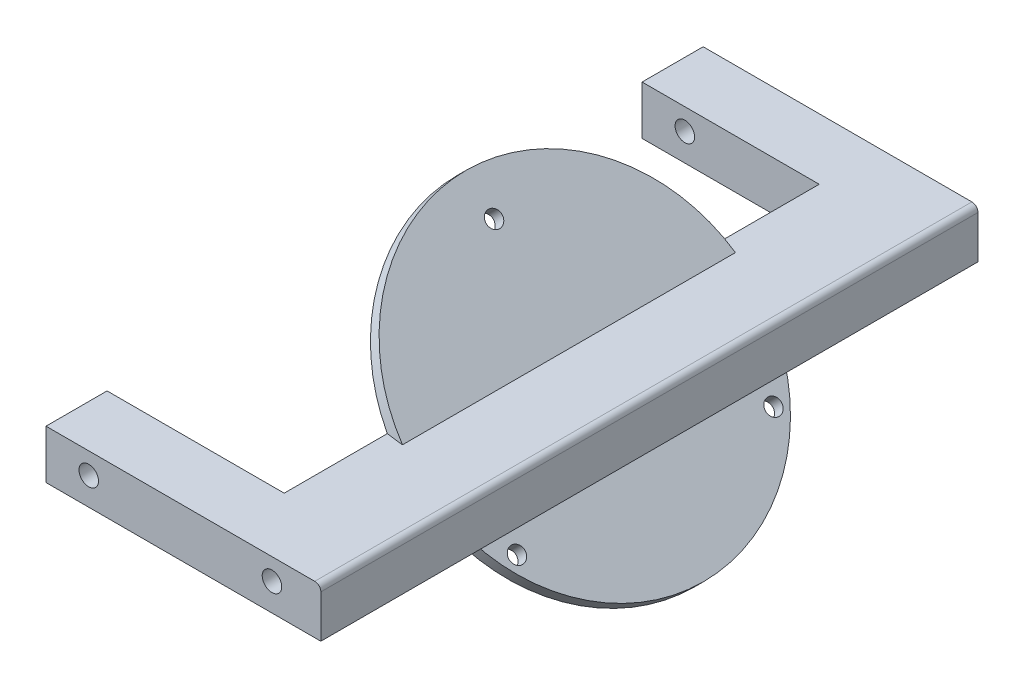
ISO-10303-21;
HEADER;
FILE_DESCRIPTION(('STEP AP214'),'2;1');
FILE_NAME('part.step','',(''),(''),'','','');
FILE_SCHEMA(('AUTOMOTIVE_DESIGN { 1 0 10303 214 1 1 1 1 }'));
ENDSEC;
DATA;
#1=APPLICATION_CONTEXT('core data for automotive mechanical design processes');
#2=APPLICATION_PROTOCOL_DEFINITION('international standard','automotive_design',2000,#1);
#3=PRODUCT_CONTEXT('',#1,'mechanical');
#4=PRODUCT('Part','Part','',(#3));
#5=PRODUCT_RELATED_PRODUCT_CATEGORY('part','',(#4));
#6=PRODUCT_DEFINITION_FORMATION('','',#4);
#7=PRODUCT_DEFINITION_CONTEXT('part definition',#1,'design');
#8=PRODUCT_DEFINITION('design','',#6,#7);
#9=PRODUCT_DEFINITION_SHAPE('','',#8);
#10=(LENGTH_UNIT() NAMED_UNIT(*) SI_UNIT(.MILLI.,.METRE.));
#11=(NAMED_UNIT(*) PLANE_ANGLE_UNIT() SI_UNIT($,.RADIAN.));
#12=(NAMED_UNIT(*) SI_UNIT($,.STERADIAN.) SOLID_ANGLE_UNIT());
#13=UNCERTAINTY_MEASURE_WITH_UNIT(LENGTH_MEASURE(1.E-05),#10,'distance_accuracy_value','');
#14=(GEOMETRIC_REPRESENTATION_CONTEXT(3) GLOBAL_UNCERTAINTY_ASSIGNED_CONTEXT((#13)) GLOBAL_UNIT_ASSIGNED_CONTEXT((#10,
#11,#12)) REPRESENTATION_CONTEXT('',''));
#15=CARTESIAN_POINT('',(0.,0.,0.));
#16=DIRECTION('',(0.,0.,1.));
#17=DIRECTION('',(1.,0.,0.));
#18=AXIS2_PLACEMENT_3D('',#15,#16,#17);
#19=CARTESIAN_POINT('',(0.,-4.,53.8));
#20=DIRECTION('',(0.707106781186551,0.707106781186544,0.));
#21=DIRECTION('',(-0.707106781186544,0.707106781186551,0.));
#22=AXIS2_PLACEMENT_3D('',#19,#20,#21);
#23=PLANE('',#22);
#24=CARTESIAN_POINT('',(-3.99999999999998,0.,0.));
#25=DIRECTION('',(0.707106781186551,0.707106781186544,0.));
#26=DIRECTION('',(-0.707106781186544,0.707106781186551,0.));
#27=AXIS2_PLACEMENT_3D('',#24,#25,#26);
#28=CIRCLE('',#27,12.);
#29=CARTESIAN_POINT('',(-12.4852813742385,8.48528137423861,0.));
#30=VERTEX_POINT('',#29);
#31=EDGE_CURVE('E213',#30,#30,#28,.T.);
#32=ORIENTED_EDGE('',*,*,#31,.T.);
#33=EDGE_LOOP('',(#32));
#34=FACE_BOUND('',#33,.T.);
#35=CARTESIAN_POINT('',(-18.8492424049174,14.8492424049176,0.));
#36=DIRECTION('',(0.707106781186551,0.707106781186544,0.));
#37=DIRECTION('',(-0.707106781186544,0.707106781186551,0.));
#38=AXIS2_PLACEMENT_3D('',#35,#36,#37);
#39=CIRCLE('',#38,1.29999999999999);
#40=CARTESIAN_POINT('',(-19.7684812204599,15.7684812204601,0.));
#41=VERTEX_POINT('',#40);
#42=EDGE_CURVE('E221',#41,#41,#39,.T.);
#43=ORIENTED_EDGE('',*,*,#42,.T.);
#44=EDGE_LOOP('',(#43));
#45=FACE_BOUND('',#44,.T.);
#46=CARTESIAN_POINT('',(5.89949493661166,-9.89949493661172,-21.));
#47=DIRECTION('',(0.707106781186551,0.707106781186544,0.));
#48=DIRECTION('',(-0.707106781186544,0.707106781186551,0.));
#49=AXIS2_PLACEMENT_3D('',#46,#47,#48);
#50=CIRCLE('',#49,1.29999999999999);
#51=CARTESIAN_POINT('',(4.98025612106916,-8.98025612106921,-21.));
#52=VERTEX_POINT('',#51);
#53=EDGE_CURVE('E229',#52,#52,#50,.T.);
#54=ORIENTED_EDGE('',*,*,#53,.T.);
#55=EDGE_LOOP('',(#54));
#56=FACE_BOUND('',#55,.T.);
#57=CARTESIAN_POINT('',(5.89949493661166,-9.89949493661172,21.));
#58=DIRECTION('',(0.707106781186551,0.707106781186544,0.));
#59=DIRECTION('',(-0.707106781186544,0.707106781186551,0.));
#60=AXIS2_PLACEMENT_3D('',#57,#58,#59);
#61=CIRCLE('',#60,1.29999999999999);
#62=CARTESIAN_POINT('',(4.98025612106916,-8.98025612106921,21.));
#63=VERTEX_POINT('',#62);
#64=EDGE_CURVE('E237',#63,#63,#61,.T.);
#65=ORIENTED_EDGE('',*,*,#64,.T.);
#66=EDGE_LOOP('',(#65));
#67=FACE_BOUND('',#66,.T.);
#68=DIRECTION('',(-0.707106781186546,0.707106781186548,0.));
#69=VECTOR('',#68,1.);
#70=CARTESIAN_POINT('',(-7.99999999999994,3.99999999999996,-43.8));
#71=LINE('',#70,#69);
#72=CARTESIAN_POINT('',(0.,-4.,-43.8));
#73=VERTEX_POINT('',#72);
#74=CARTESIAN_POINT('',(-7.99999999999991,4.,-43.8));
#75=VERTEX_POINT('',#74);
#76=EDGE_CURVE('E167',#73,#75,#71,.T.);
#77=ORIENTED_EDGE('',*,*,#76,.F.);
#78=DIRECTION('',(0.,0.,-1.));
#79=VECTOR('',#78,1.);
#80=CARTESIAN_POINT('',(0.,-4.,53.8));
#81=LINE('',#80,#79);
#82=CARTESIAN_POINT('',(0.,-4.,-26.9118932815958));
#83=VERTEX_POINT('',#82);
#84=EDGE_CURVE('E165',#83,#73,#81,.T.);
#85=ORIENTED_EDGE('',*,*,#84,.F.);
#86=CARTESIAN_POINT('',(-3.99999999999997,0.,0.));
#87=DIRECTION('',(-0.707106781186548,-0.707106781186548,0.));
#88=DIRECTION('',(0.707106781186548,-0.707106781186548,0.));
#89=AXIS2_PLACEMENT_3D('',#86,#87,#88);
#90=CIRCLE('',#89,27.5);
#91=CARTESIAN_POINT('',(0.,-4.,26.9118932815958));
#92=VERTEX_POINT('',#91);
#93=EDGE_CURVE('E241',#83,#92,#90,.T.);
#94=ORIENTED_EDGE('',*,*,#93,.T.);
#95=CARTESIAN_POINT('',(0.,-4.,43.8));
#96=VERTEX_POINT('',#95);
#97=EDGE_CURVE('E281',#96,#92,#81,.T.);
#98=ORIENTED_EDGE('',*,*,#97,.F.);
#99=DIRECTION('',(-0.707106781186546,0.707106781186548,0.));
#100=VECTOR('',#99,1.);
#101=CARTESIAN_POINT('',(-7.99999999999994,3.99999999999996,43.8));
#102=LINE('',#101,#100);
#103=CARTESIAN_POINT('',(-7.99999999999994,3.99999999999996,43.8));
#104=VERTEX_POINT('',#103);
#105=EDGE_CURVE('E190',#96,#104,#102,.T.);
#106=ORIENTED_EDGE('',*,*,#105,.T.);
#107=DIRECTION('',(0.,0.,-1.));
#108=VECTOR('',#107,1.);
#109=CARTESIAN_POINT('',(-7.99999999999991,4.,53.8));
#110=LINE('',#109,#108);
#111=CARTESIAN_POINT('',(-7.99999999999994,3.99999999999996,26.9118932815958));
#112=VERTEX_POINT('',#111);
#113=EDGE_CURVE('E285',#104,#112,#110,.T.);
#114=ORIENTED_EDGE('',*,*,#113,.T.);
#115=CARTESIAN_POINT('',(-7.99999999999991,4.,-26.9118932815958));
#116=VERTEX_POINT('',#115);
#117=EDGE_CURVE('E247',#112,#116,#90,.T.);
#118=ORIENTED_EDGE('',*,*,#117,.T.);
#119=EDGE_CURVE('E284',#116,#75,#110,.T.);
#120=ORIENTED_EDGE('',*,*,#119,.T.);
#121=EDGE_LOOP('',(#77,#85,#94,#98,#106,#114,#118,#120));
#122=FACE_BOUND('',#121,.T.);
#123=ADVANCED_FACE('F43',(#34,#45,#56,#67,#122),#23,.F.);
#124=CARTESIAN_POINT('',(7.99999999999991,4.,53.8));
#125=DIRECTION('',(-1.,0.,0.));
#126=DIRECTION('',(0.,0.,1.));
#127=AXIS2_PLACEMENT_3D('',#124,#125,#126);
#128=PLANE('',#127);
#129=DIRECTION('',(0.,1.,0.));
#130=VECTOR('',#129,1.);
#131=CARTESIAN_POINT('',(7.99999999999991,4.,-53.8));
#132=LINE('',#131,#130);
#133=CARTESIAN_POINT('',(7.99999999999991,-4.,-53.8));
#134=VERTEX_POINT('',#133);
#135=CARTESIAN_POINT('',(7.99999999999991,3.,-53.8));
#136=VERTEX_POINT('',#135);
#137=EDGE_CURVE('E270',#134,#136,#132,.T.);
#138=ORIENTED_EDGE('',*,*,#137,.T.);
#139=DIRECTION('',(0.,0.,-1.));
#140=VECTOR('',#139,1.);
#141=CARTESIAN_POINT('',(7.99999999999991,3.,53.8));
#142=LINE('',#141,#140);
#143=CARTESIAN_POINT('',(7.99999999999991,3.,53.8));
#144=VERTEX_POINT('',#143);
#145=EDGE_CURVE('E52',#136,#144,#142,.F.);
#146=ORIENTED_EDGE('',*,*,#145,.T.);
#147=DIRECTION('',(0.,1.,0.));
#148=VECTOR('',#147,1.);
#149=CARTESIAN_POINT('',(7.99999999999991,4.,53.8));
#150=LINE('',#149,#148);
#151=CARTESIAN_POINT('',(7.99999999999991,-4.,53.8));
#152=VERTEX_POINT('',#151);
#153=EDGE_CURVE('E259',#152,#144,#150,.T.);
#154=ORIENTED_EDGE('',*,*,#153,.F.);
#155=DIRECTION('',(0.,0.,-1.));
#156=VECTOR('',#155,1.);
#157=CARTESIAN_POINT('',(7.99999999999991,-4.,53.8));
#158=LINE('',#157,#156);
#159=EDGE_CURVE('E269',#152,#134,#158,.T.);
#160=ORIENTED_EDGE('',*,*,#159,.T.);
#161=EDGE_LOOP('',(#138,#146,#154,#160));
#162=FACE_BOUND('',#161,.T.);
#163=ADVANCED_FACE('F362',(#162),#128,.F.);
#164=CARTESIAN_POINT('',(7.99999999999991,4.,53.8));
#165=DIRECTION('',(0.,-1.,0.));
#166=DIRECTION('',(1.,0.,0.));
#167=AXIS2_PLACEMENT_3D('',#164,#165,#166);
#168=PLANE('',#167);
#169=DIRECTION('',(-1.,0.,0.));
#170=VECTOR('',#169,1.);
#171=CARTESIAN_POINT('',(7.99999999999991,4.,53.8));
#172=LINE('',#171,#170);
#173=CARTESIAN_POINT('',(6.99999999999991,4.,53.8));
#174=VERTEX_POINT('',#173);
#175=CARTESIAN_POINT('',(-37.0000000000001,3.99999999999996,53.8));
#176=VERTEX_POINT('',#175);
#177=EDGE_CURVE('E262',#174,#176,#172,.T.);
#178=ORIENTED_EDGE('',*,*,#177,.F.);
#179=DIRECTION('',(0.,0.,-1.));
#180=VECTOR('',#179,1.);
#181=CARTESIAN_POINT('',(6.99999999999991,4.,53.8));
#182=LINE('',#181,#180);
#183=CARTESIAN_POINT('',(6.99999999999991,4.,-53.8));
#184=VERTEX_POINT('',#183);
#185=EDGE_CURVE('E304',#174,#184,#182,.T.);
#186=ORIENTED_EDGE('',*,*,#185,.T.);
#187=DIRECTION('',(-1.,0.,0.));
#188=VECTOR('',#187,1.);
#189=CARTESIAN_POINT('',(7.99999999999991,4.,-53.8));
#190=LINE('',#189,#188);
#191=CARTESIAN_POINT('',(-37.0000000000001,3.99999999999996,-53.8));
#192=VERTEX_POINT('',#191);
#193=EDGE_CURVE('E273',#184,#192,#190,.T.);
#194=ORIENTED_EDGE('',*,*,#193,.T.);
#195=DIRECTION('',(0.,0.,-1.));
#196=VECTOR('',#195,1.);
#197=CARTESIAN_POINT('',(-37.0000000000001,3.99999999999996,-43.8));
#198=LINE('',#197,#196);
#199=CARTESIAN_POINT('',(-37.0000000000001,3.99999999999996,-43.8));
#200=VERTEX_POINT('',#199);
#201=EDGE_CURVE('E160',#200,#192,#198,.T.);
#202=ORIENTED_EDGE('',*,*,#201,.F.);
#203=DIRECTION('',(-1.,0.,0.));
#204=VECTOR('',#203,1.);
#205=CARTESIAN_POINT('',(-37.0000000000001,3.99999999999996,-43.8));
#206=LINE('',#205,#204);
#207=EDGE_CURVE('E146',#75,#200,#206,.T.);
#208=ORIENTED_EDGE('',*,*,#207,.F.);
#209=ORIENTED_EDGE('',*,*,#119,.F.);
#210=CARTESIAN_POINT('',(0.,4.,0.));
#211=DIRECTION('',(0.,-1.,0.));
#212=DIRECTION('',(-1.,0.,0.));
#213=AXIS2_PLACEMENT_3D('',#210,#211,#212);
#214=ELLIPSE('',#213,38.8908729652601,27.5);
#215=CARTESIAN_POINT('',(-5.17157287525379,4.,-27.2557776810343));
#216=VERTEX_POINT('',#215);
#217=EDGE_CURVE('E258',#116,#216,#214,.T.);
#218=ORIENTED_EDGE('',*,*,#217,.T.);
#219=DIRECTION('',(0.,0.,-1.));
#220=VECTOR('',#219,1.);
#221=CARTESIAN_POINT('',(-5.1715728752538,4.,53.8));
#222=LINE('',#221,#220);
#223=CARTESIAN_POINT('',(-5.17157287525379,4.,27.2557776810343));
#224=VERTEX_POINT('',#223);
#225=EDGE_CURVE('E251',#224,#216,#222,.T.);
#226=ORIENTED_EDGE('',*,*,#225,.F.);
#227=EDGE_CURVE('E254',#224,#112,#214,.T.);
#228=ORIENTED_EDGE('',*,*,#227,.T.);
#229=ORIENTED_EDGE('',*,*,#113,.F.);
#230=DIRECTION('',(-1.,0.,0.));
#231=VECTOR('',#230,1.);
#232=CARTESIAN_POINT('',(-37.0000000000001,3.99999999999996,43.8));
#233=LINE('',#232,#231);
#234=CARTESIAN_POINT('',(-37.0000000000001,3.99999999999996,43.8));
#235=VERTEX_POINT('',#234);
#236=EDGE_CURVE('E179',#104,#235,#233,.T.);
#237=ORIENTED_EDGE('',*,*,#236,.T.);
#238=DIRECTION('',(0.,0.,1.));
#239=VECTOR('',#238,1.);
#240=CARTESIAN_POINT('',(-37.0000000000001,3.99999999999996,43.8));
#241=LINE('',#240,#239);
#242=EDGE_CURVE('E194',#235,#176,#241,.T.);
#243=ORIENTED_EDGE('',*,*,#242,.T.);
#244=EDGE_LOOP('',(#178,#186,#194,#202,#208,#209,#218,#226,#228,#229,#237,#243));
#245=FACE_BOUND('',#244,.T.);
#246=ADVANCED_FACE('F334',(#245),#168,.F.);
#247=CARTESIAN_POINT('',(7.99999999999991,-4.,53.8));
#248=DIRECTION('',(0.,1.,0.));
#249=DIRECTION('',(0.,0.,1.));
#250=AXIS2_PLACEMENT_3D('',#247,#248,#249);
#251=PLANE('',#250);
#252=DIRECTION('',(1.,0.,0.));
#253=VECTOR('',#252,1.);
#254=CARTESIAN_POINT('',(7.99999999999991,-4.,53.8));
#255=LINE('',#254,#253);
#256=CARTESIAN_POINT('',(-37.0000000000001,-4.,53.8));
#257=VERTEX_POINT('',#256);
#258=EDGE_CURVE('E266',#257,#152,#255,.T.);
#259=ORIENTED_EDGE('',*,*,#258,.F.);
#260=DIRECTION('',(0.,0.,1.));
#261=VECTOR('',#260,1.);
#262=CARTESIAN_POINT('',(-37.0000000000001,-4.,43.8));
#263=LINE('',#262,#261);
#264=CARTESIAN_POINT('',(-37.0000000000001,-4.,43.8));
#265=VERTEX_POINT('',#264);
#266=EDGE_CURVE('E198',#265,#257,#263,.T.);
#267=ORIENTED_EDGE('',*,*,#266,.F.);
#268=DIRECTION('',(1.,0.,0.));
#269=VECTOR('',#268,1.);
#270=CARTESIAN_POINT('',(0.,-4.,43.8));
#271=LINE('',#270,#269);
#272=EDGE_CURVE('E187',#265,#96,#271,.T.);
#273=ORIENTED_EDGE('',*,*,#272,.T.);
#274=ORIENTED_EDGE('',*,*,#97,.T.);
#275=CARTESIAN_POINT('',(-7.99999999999996,-4.,0.));
#276=DIRECTION('',(0.,1.,0.));
#277=DIRECTION('',(-1.,0.,0.));
#278=AXIS2_PLACEMENT_3D('',#275,#276,#277);
#279=ELLIPSE('',#278,38.8908729652601,27.5);
#280=CARTESIAN_POINT('',(2.82842712474621,-4.,26.4125459394211));
#281=VERTEX_POINT('',#280);
#282=EDGE_CURVE('E295',#92,#281,#279,.T.);
#283=ORIENTED_EDGE('',*,*,#282,.T.);
#284=DIRECTION('',(0.,0.,1.));
#285=VECTOR('',#284,1.);
#286=CARTESIAN_POINT('',(2.8284271247462,-4.,53.8));
#287=LINE('',#286,#285);
#288=CARTESIAN_POINT('',(2.82842712474621,-4.,-26.4125459394211));
#289=VERTEX_POINT('',#288);
#290=EDGE_CURVE('E288',#289,#281,#287,.T.);
#291=ORIENTED_EDGE('',*,*,#290,.F.);
#292=EDGE_CURVE('E292',#289,#83,#279,.T.);
#293=ORIENTED_EDGE('',*,*,#292,.T.);
#294=ORIENTED_EDGE('',*,*,#84,.T.);
#295=DIRECTION('',(1.,0.,0.));
#296=VECTOR('',#295,1.);
#297=CARTESIAN_POINT('',(0.,-4.,-43.8));
#298=LINE('',#297,#296);
#299=CARTESIAN_POINT('',(-37.0000000000001,-4.,-43.8));
#300=VERTEX_POINT('',#299);
#301=EDGE_CURVE('E144',#300,#73,#298,.T.);
#302=ORIENTED_EDGE('',*,*,#301,.F.);
#303=DIRECTION('',(0.,0.,-1.));
#304=VECTOR('',#303,1.);
#305=CARTESIAN_POINT('',(-37.0000000000001,-4.,-43.8));
#306=LINE('',#305,#304);
#307=CARTESIAN_POINT('',(-37.0000000000001,-4.,-53.8));
#308=VERTEX_POINT('',#307);
#309=EDGE_CURVE('E151',#300,#308,#306,.T.);
#310=ORIENTED_EDGE('',*,*,#309,.T.);
#311=DIRECTION('',(1.,0.,0.));
#312=VECTOR('',#311,1.);
#313=CARTESIAN_POINT('',(7.99999999999991,-4.,-53.8));
#314=LINE('',#313,#312);
#315=EDGE_CURVE('E263',#308,#134,#314,.T.);
#316=ORIENTED_EDGE('',*,*,#315,.T.);
#317=ORIENTED_EDGE('',*,*,#159,.F.);
#318=EDGE_LOOP('',(#259,#267,#273,#274,#283,#291,#293,#294,#302,#310,#316,#317));
#319=FACE_BOUND('',#318,.T.);
#320=ADVANCED_FACE('F163',(#319),#251,.F.);
#321=CARTESIAN_POINT('',(0.,0.,53.8));
#322=DIRECTION('',(0.,0.,-1.));
#323=DIRECTION('',(-1.,0.,0.));
#324=AXIS2_PLACEMENT_3D('',#321,#322,#323);
#325=PLANE('',#324);
#326=CARTESIAN_POINT('',(-30.0000000000001,0.499999999999999,53.8));
#327=DIRECTION('',(0.,0.,1.));
#328=DIRECTION('',(1.,0.,0.));
#329=AXIS2_PLACEMENT_3D('',#326,#327,#328);
#330=CIRCLE('',#329,1.59999999999999);
#331=CARTESIAN_POINT('',(-28.4000000000001,0.499999999999999,53.8));
#332=VERTEX_POINT('',#331);
#333=EDGE_CURVE('E343',#332,#332,#330,.T.);
#334=ORIENTED_EDGE('',*,*,#333,.F.);
#335=EDGE_LOOP('',(#334));
#336=FACE_BOUND('',#335,.T.);
#337=CARTESIAN_POINT('',(0.,0.499999999999999,53.8));
#338=DIRECTION('',(0.,0.,1.));
#339=DIRECTION('',(1.,0.,0.));
#340=AXIS2_PLACEMENT_3D('',#337,#338,#339);
#341=CIRCLE('',#340,1.59999999999999);
#342=CARTESIAN_POINT('',(1.59999999999999,0.499999999999999,53.8));
#343=VERTEX_POINT('',#342);
#344=EDGE_CURVE('E202',#343,#343,#341,.T.);
#345=ORIENTED_EDGE('',*,*,#344,.F.);
#346=EDGE_LOOP('',(#345));
#347=FACE_BOUND('',#346,.T.);
#348=ORIENTED_EDGE('',*,*,#153,.T.);
#349=CARTESIAN_POINT('',(6.99999999999991,3.,53.8));
#350=DIRECTION('',(0.,0.,-1.));
#351=DIRECTION('',(-1.,0.,0.));
#352=AXIS2_PLACEMENT_3D('',#349,#350,#351);
#353=CIRCLE('',#352,1.);
#354=EDGE_CURVE('E11',#144,#174,#353,.F.);
#355=ORIENTED_EDGE('',*,*,#354,.T.);
#356=ORIENTED_EDGE('',*,*,#177,.T.);
#357=DIRECTION('',(0.,-1.,0.));
#358=VECTOR('',#357,1.);
#359=CARTESIAN_POINT('',(-37.0000000000001,-4.,53.8));
#360=LINE('',#359,#358);
#361=EDGE_CURVE('E177',#176,#257,#360,.T.);
#362=ORIENTED_EDGE('',*,*,#361,.T.);
#363=ORIENTED_EDGE('',*,*,#258,.T.);
#364=EDGE_LOOP('',(#348,#355,#356,#362,#363));
#365=FACE_BOUND('',#364,.T.);
#366=ADVANCED_FACE('F351',(#336,#347,#365),#325,.F.);
#367=CARTESIAN_POINT('',(0.,0.,-53.8));
#368=DIRECTION('',(0.,0.,-1.));
#369=DIRECTION('',(-1.,0.,0.));
#370=AXIS2_PLACEMENT_3D('',#367,#368,#369);
#371=PLANE('',#370);
#372=CARTESIAN_POINT('',(-30.0000000000001,0.499999999999999,-53.8));
#373=DIRECTION('',(0.,0.,1.));
#374=DIRECTION('',(1.,0.,0.));
#375=AXIS2_PLACEMENT_3D('',#372,#373,#374);
#376=CIRCLE('',#375,1.59999999999997);
#377=CARTESIAN_POINT('',(-28.4000000000001,0.499999999999999,-53.8));
#378=VERTEX_POINT('',#377);
#379=EDGE_CURVE('E309',#378,#378,#376,.T.);
#380=ORIENTED_EDGE('',*,*,#379,.T.);
#381=EDGE_LOOP('',(#380));
#382=FACE_BOUND('',#381,.T.);
#383=CARTESIAN_POINT('',(0.,0.499999999999999,-53.8));
#384=DIRECTION('',(0.,0.,1.));
#385=DIRECTION('',(1.,0.,0.));
#386=AXIS2_PLACEMENT_3D('',#383,#384,#385);
#387=CIRCLE('',#386,1.59999999999997);
#388=CARTESIAN_POINT('',(1.59999999999997,0.499999999999999,-53.8));
#389=VERTEX_POINT('',#388);
#390=EDGE_CURVE('E209',#389,#389,#387,.T.);
#391=ORIENTED_EDGE('',*,*,#390,.T.);
#392=EDGE_LOOP('',(#391));
#393=FACE_BOUND('',#392,.T.);
#394=ORIENTED_EDGE('',*,*,#193,.F.);
#395=CARTESIAN_POINT('',(6.99999999999991,3.,-53.8));
#396=DIRECTION('',(0.,0.,-1.));
#397=DIRECTION('',(-1.,0.,0.));
#398=AXIS2_PLACEMENT_3D('',#395,#396,#397);
#399=CIRCLE('',#398,1.);
#400=EDGE_CURVE('E66',#184,#136,#399,.T.);
#401=ORIENTED_EDGE('',*,*,#400,.T.);
#402=ORIENTED_EDGE('',*,*,#137,.F.);
#403=ORIENTED_EDGE('',*,*,#315,.F.);
#404=DIRECTION('',(0.,-1.,0.));
#405=VECTOR('',#404,1.);
#406=CARTESIAN_POINT('',(-37.0000000000001,-4.,-53.8));
#407=LINE('',#406,#405);
#408=EDGE_CURVE('E157',#192,#308,#407,.T.);
#409=ORIENTED_EDGE('',*,*,#408,.F.);
#410=EDGE_LOOP('',(#394,#401,#402,#403,#409));
#411=FACE_BOUND('',#410,.T.);
#412=ADVANCED_FACE('F354',(#382,#393,#411),#371,.T.);
#413=CARTESIAN_POINT('',(-0.585786437626897,-0.585786437626897,0.));
#414=DIRECTION('',(-0.707106781186548,-0.707106781186548,0.));
#415=DIRECTION('',(0.707106781186548,-0.707106781186548,0.));
#416=AXIS2_PLACEMENT_3D('',#413,#414,#415);
#417=PLANE('',#416);
#418=CARTESIAN_POINT('',(7.31370849898479,-8.48528137423859,-21.));
#419=DIRECTION('',(0.707106781186548,0.707106781186547,0.));
#420=DIRECTION('',(-0.707106781186547,0.707106781186548,0.));
#421=AXIS2_PLACEMENT_3D('',#418,#419,#420);
#422=CIRCLE('',#421,1.3);
#423=CARTESIAN_POINT('',(6.39446968344228,-7.56604255869608,-21.));
#424=VERTEX_POINT('',#423);
#425=EDGE_CURVE('E225',#424,#424,#422,.T.);
#426=ORIENTED_EDGE('',*,*,#425,.F.);
#427=EDGE_LOOP('',(#426));
#428=FACE_BOUND('',#427,.T.);
#429=CARTESIAN_POINT('',(7.31370849898479,-8.48528137423859,21.));
#430=DIRECTION('',(0.707106781186548,0.707106781186547,0.));
#431=DIRECTION('',(-0.707106781186547,0.707106781186548,0.));
#432=AXIS2_PLACEMENT_3D('',#429,#430,#431);
#433=CIRCLE('',#432,1.3);
#434=CARTESIAN_POINT('',(6.39446968344228,-7.56604255869608,21.));
#435=VERTEX_POINT('',#434);
#436=EDGE_CURVE('E233',#435,#435,#433,.T.);
#437=ORIENTED_EDGE('',*,*,#436,.F.);
#438=EDGE_LOOP('',(#437));
#439=FACE_BOUND('',#438,.T.);
#440=CARTESIAN_POINT('',(-2.58578643762687,1.41421356237309,0.));
#441=DIRECTION('',(-0.707106781186548,-0.707106781186548,0.));
#442=DIRECTION('',(0.707106781186548,-0.707106781186548,0.));
#443=AXIS2_PLACEMENT_3D('',#440,#441,#442);
#444=CIRCLE('',#443,27.5);
#445=EDGE_CURVE('E242',#289,#281,#444,.T.);
#446=ORIENTED_EDGE('',*,*,#445,.F.);
#447=ORIENTED_EDGE('',*,*,#290,.T.);
#448=EDGE_LOOP('',(#446,#447));
#449=FACE_BOUND('',#448,.T.);
#450=ADVANCED_FACE('F414',(#428,#439,#449),#417,.F.);
#451=CARTESIAN_POINT('',(-2.58578643762687,1.41421356237309,0.));
#452=DIRECTION('',(-0.707106781186547,-0.707106781186548,0.));
#453=DIRECTION('',(0.707106781186548,-0.707106781186547,0.));
#454=AXIS2_PLACEMENT_3D('',#451,#452,#453);
#455=CYLINDRICAL_SURFACE('',#454,27.5);
#456=ORIENTED_EDGE('',*,*,#282,.F.);
#457=ORIENTED_EDGE('',*,*,#93,.F.);
#458=ORIENTED_EDGE('',*,*,#292,.F.);
#459=ORIENTED_EDGE('',*,*,#445,.T.);
#460=EDGE_LOOP('',(#456,#457,#458,#459));
#461=FACE_BOUND('',#460,.T.);
#462=ADVANCED_FACE('F418',(#461),#455,.T.);
#463=ORIENTED_EDGE('',*,*,#217,.F.);
#464=ORIENTED_EDGE('',*,*,#117,.F.);
#465=ORIENTED_EDGE('',*,*,#227,.F.);
#466=EDGE_CURVE('E246',#224,#216,#444,.T.);
#467=ORIENTED_EDGE('',*,*,#466,.T.);
#468=EDGE_LOOP('',(#463,#464,#465,#467));
#469=FACE_BOUND('',#468,.T.);
#470=ADVANCED_FACE('F329',(#469),#455,.T.);
#471=CARTESIAN_POINT('',(-17.4350288425444,16.2634559672906,0.));
#472=DIRECTION('',(0.707106781186548,0.707106781186547,0.));
#473=DIRECTION('',(-0.707106781186547,0.707106781186548,0.));
#474=AXIS2_PLACEMENT_3D('',#471,#472,#473);
#475=CIRCLE('',#474,1.3);
#476=CARTESIAN_POINT('',(-18.3542676580869,17.1826947828331,0.));
#477=VERTEX_POINT('',#476);
#478=EDGE_CURVE('E217',#477,#477,#475,.T.);
#479=ORIENTED_EDGE('',*,*,#478,.F.);
#480=EDGE_LOOP('',(#479));
#481=FACE_BOUND('',#480,.T.);
#482=ORIENTED_EDGE('',*,*,#466,.F.);
#483=ORIENTED_EDGE('',*,*,#225,.T.);
#484=EDGE_LOOP('',(#482,#483));
#485=FACE_BOUND('',#484,.T.);
#486=ADVANCED_FACE('F402',(#481,#485),#417,.F.);
#487=CARTESIAN_POINT('',(7.31370849898479,-8.48528137423859,21.));
#488=DIRECTION('',(0.707106781186548,0.707106781186547,0.));
#489=DIRECTION('',(-0.707106781186547,0.707106781186548,0.));
#490=AXIS2_PLACEMENT_3D('',#487,#488,#489);
#491=CYLINDRICAL_SURFACE('',#490,1.29999999999999);
#492=ORIENTED_EDGE('',*,*,#436,.T.);
#493=EDGE_LOOP('',(#492));
#494=FACE_BOUND('',#493,.T.);
#495=ORIENTED_EDGE('',*,*,#64,.F.);
#496=EDGE_LOOP('',(#495));
#497=FACE_BOUND('',#496,.T.);
#498=ADVANCED_FACE('F399',(#494,#497),#491,.F.);
#499=CARTESIAN_POINT('',(7.31370849898479,-8.48528137423859,-21.));
#500=DIRECTION('',(0.707106781186548,0.707106781186547,0.));
#501=DIRECTION('',(-0.707106781186547,0.707106781186548,0.));
#502=AXIS2_PLACEMENT_3D('',#499,#500,#501);
#503=CYLINDRICAL_SURFACE('',#502,1.29999999999999);
#504=ORIENTED_EDGE('',*,*,#425,.T.);
#505=EDGE_LOOP('',(#504));
#506=FACE_BOUND('',#505,.T.);
#507=ORIENTED_EDGE('',*,*,#53,.F.);
#508=EDGE_LOOP('',(#507));
#509=FACE_BOUND('',#508,.T.);
#510=ADVANCED_FACE('F401',(#506,#509),#503,.F.);
#511=CARTESIAN_POINT('',(-17.4350288425444,16.2634559672906,0.));
#512=DIRECTION('',(0.707106781186548,0.707106781186547,0.));
#513=DIRECTION('',(-0.707106781186547,0.707106781186548,0.));
#514=AXIS2_PLACEMENT_3D('',#511,#512,#513);
#515=CYLINDRICAL_SURFACE('',#514,1.29999999999999);
#516=ORIENTED_EDGE('',*,*,#478,.T.);
#517=EDGE_LOOP('',(#516));
#518=FACE_BOUND('',#517,.T.);
#519=ORIENTED_EDGE('',*,*,#42,.F.);
#520=EDGE_LOOP('',(#519));
#521=FACE_BOUND('',#520,.T.);
#522=ADVANCED_FACE('F409',(#518,#521),#515,.F.);
#523=CARTESIAN_POINT('',(-9.30330085889911,-5.30330085889909,0.));
#524=DIRECTION('',(0.707106781186551,0.707106781186544,0.));
#525=DIRECTION('',(0.,0.,-1.));
#526=AXIS2_PLACEMENT_3D('',#523,#524,#525);
#527=SPHERICAL_SURFACE('',#526,6.5);
#528=CARTESIAN_POINT('',(-8.41786389677114,-4.41786389677112,0.));
#529=DIRECTION('',(-0.707106781186551,-0.707106781186544,0.));
#530=DIRECTION('',(0.707106781186544,-0.707106781186551,0.));
#531=AXIS2_PLACEMENT_3D('',#528,#529,#530);
#532=CIRCLE('',#531,6.37824448984163);
#533=CARTESIAN_POINT('',(-3.90776396593841,-8.9279638276039,0.));
#534=VERTEX_POINT('',#533);
#535=EDGE_CURVE('E300',#534,#534,#532,.T.);
#536=ORIENTED_EDGE('',*,*,#535,.T.);
#537=EDGE_LOOP('',(#536));
#538=FACE_BOUND('',#537,.T.);
#539=ADVANCED_FACE('F384',(#538),#527,.F.);
#540=CARTESIAN_POINT('',(-9.30330085889911,-5.30330085889909,0.));
#541=DIRECTION('',(0.707106781186551,0.707106781186544,0.));
#542=DIRECTION('',(-0.707106781186544,0.707106781186551,0.));
#543=AXIS2_PLACEMENT_3D('',#540,#541,#542);
#544=CONICAL_SURFACE('',#543,6.5,0.632748835002183);
#545=CARTESIAN_POINT('',(-8.558831989572,-4.55883198957198,0.));
#546=DIRECTION('',(-0.707106781186551,-0.707106781186544,0.));
#547=DIRECTION('',(0.707106781186544,-0.707106781186551,0.));
#548=AXIS2_PLACEMENT_3D('',#545,#546,#547);
#549=CIRCLE('',#548,7.27208117929577);
#550=CARTESIAN_POINT('',(-3.41669407435292,-9.70096990479112,0.));
#551=VERTEX_POINT('',#550);
#552=EDGE_CURVE('E296',#551,#551,#549,.F.);
#553=ORIENTED_EDGE('',*,*,#552,.T.);
#554=EDGE_LOOP('',(#553));
#555=FACE_BOUND('',#554,.T.);
#556=ORIENTED_EDGE('',*,*,#31,.F.);
#557=EDGE_LOOP('',(#556));
#558=FACE_BOUND('',#557,.T.);
#559=ADVANCED_FACE('F375',(#555,#558),#544,.T.);
#560=CARTESIAN_POINT('',(-8.34975336122283,-4.34975336122282,0.));
#561=DIRECTION('',(-0.707106781186551,-0.707106781186544,0.));
#562=DIRECTION('',(0.707106781186544,-0.707106781186551,0.));
#563=AXIS2_PLACEMENT_3D('',#560,#561,#562);
#564=TOROIDAL_SURFACE('',#563,6.86887868136791,0.5);
#565=ORIENTED_EDGE('',*,*,#535,.F.);
#566=EDGE_LOOP('',(#565));
#567=FACE_BOUND('',#566,.T.);
#568=ORIENTED_EDGE('',*,*,#552,.F.);
#569=EDGE_LOOP('',(#568));
#570=FACE_BOUND('',#569,.T.);
#571=ADVANCED_FACE('F372',(#567,#570),#564,.T.);
#572=CARTESIAN_POINT('',(0.,0.499999999999999,53.8));
#573=DIRECTION('',(0.,0.,1.));
#574=DIRECTION('',(1.,0.,0.));
#575=AXIS2_PLACEMENT_3D('',#572,#573,#574);
#576=CYLINDRICAL_SURFACE('',#575,1.59999999999998);
#577=ORIENTED_EDGE('',*,*,#390,.F.);
#578=EDGE_LOOP('',(#577));
#579=FACE_BOUND('',#578,.T.);
#580=ORIENTED_EDGE('',*,*,#344,.T.);
#581=EDGE_LOOP('',(#580));
#582=FACE_BOUND('',#581,.T.);
#583=ADVANCED_FACE('F374',(#579,#582),#576,.F.);
#584=CARTESIAN_POINT('',(-37.0000000000001,-4.,43.8));
#585=DIRECTION('',(-1.,0.,0.));
#586=DIRECTION('',(0.,0.,1.));
#587=AXIS2_PLACEMENT_3D('',#584,#585,#586);
#588=PLANE('',#587);
#589=ORIENTED_EDGE('',*,*,#361,.F.);
#590=ORIENTED_EDGE('',*,*,#242,.F.);
#591=DIRECTION('',(0.,-1.,0.));
#592=VECTOR('',#591,1.);
#593=CARTESIAN_POINT('',(-37.0000000000001,-4.,43.8));
#594=LINE('',#593,#592);
#595=EDGE_CURVE('E183',#235,#265,#594,.T.);
#596=ORIENTED_EDGE('',*,*,#595,.T.);
#597=ORIENTED_EDGE('',*,*,#266,.T.);
#598=EDGE_LOOP('',(#589,#590,#596,#597));
#599=FACE_BOUND('',#598,.T.);
#600=ADVANCED_FACE('F381',(#599),#588,.T.);
#601=CARTESIAN_POINT('',(0.,0.,43.8));
#602=DIRECTION('',(0.,0.,1.));
#603=DIRECTION('',(1.,0.,0.));
#604=AXIS2_PLACEMENT_3D('',#601,#602,#603);
#605=PLANE('',#604);
#606=CARTESIAN_POINT('',(-30.0000000000001,0.499999999999999,43.8));
#607=DIRECTION('',(0.,0.,1.));
#608=DIRECTION('',(1.,0.,0.));
#609=AXIS2_PLACEMENT_3D('',#606,#607,#608);
#610=CIRCLE('',#609,1.59999999999998);
#611=CARTESIAN_POINT('',(-28.4000000000001,0.499999999999999,43.8));
#612=VERTEX_POINT('',#611);
#613=EDGE_CURVE('E175',#612,#612,#610,.T.);
#614=ORIENTED_EDGE('',*,*,#613,.T.);
#615=EDGE_LOOP('',(#614));
#616=FACE_BOUND('',#615,.T.);
#617=ORIENTED_EDGE('',*,*,#236,.F.);
#618=ORIENTED_EDGE('',*,*,#105,.F.);
#619=ORIENTED_EDGE('',*,*,#272,.F.);
#620=ORIENTED_EDGE('',*,*,#595,.F.);
#621=EDGE_LOOP('',(#617,#618,#619,#620));
#622=FACE_BOUND('',#621,.T.);
#623=ADVANCED_FACE('F517',(#616,#622),#605,.F.);
#624=CARTESIAN_POINT('',(-37.0000000000001,-4.,-43.8));
#625=DIRECTION('',(1.,0.,0.));
#626=DIRECTION('',(0.,0.,-1.));
#627=AXIS2_PLACEMENT_3D('',#624,#625,#626);
#628=PLANE('',#627);
#629=ORIENTED_EDGE('',*,*,#408,.T.);
#630=ORIENTED_EDGE('',*,*,#309,.F.);
#631=DIRECTION('',(0.,-1.,0.));
#632=VECTOR('',#631,1.);
#633=CARTESIAN_POINT('',(-37.0000000000001,-4.,-43.8));
#634=LINE('',#633,#632);
#635=EDGE_CURVE('E139',#200,#300,#634,.T.);
#636=ORIENTED_EDGE('',*,*,#635,.F.);
#637=ORIENTED_EDGE('',*,*,#201,.T.);
#638=EDGE_LOOP('',(#629,#630,#636,#637));
#639=FACE_BOUND('',#638,.T.);
#640=ADVANCED_FACE('F155',(#639),#628,.F.);
#641=CARTESIAN_POINT('',(0.,0.,-43.8));
#642=DIRECTION('',(0.,0.,-1.));
#643=DIRECTION('',(1.,0.,0.));
#644=AXIS2_PLACEMENT_3D('',#641,#642,#643);
#645=PLANE('',#644);
#646=CARTESIAN_POINT('',(-30.0000000000001,0.499999999999999,-43.8));
#647=DIRECTION('',(0.,0.,-1.));
#648=DIRECTION('',(-1.,0.,0.));
#649=AXIS2_PLACEMENT_3D('',#646,#647,#648);
#650=CIRCLE('',#649,1.59999999999998);
#651=CARTESIAN_POINT('',(-31.6000000000001,0.499999999999999,-43.8));
#652=VERTEX_POINT('',#651);
#653=EDGE_CURVE('E305',#652,#652,#650,.T.);
#654=ORIENTED_EDGE('',*,*,#653,.T.);
#655=EDGE_LOOP('',(#654));
#656=FACE_BOUND('',#655,.T.);
#657=ORIENTED_EDGE('',*,*,#207,.T.);
#658=ORIENTED_EDGE('',*,*,#635,.T.);
#659=ORIENTED_EDGE('',*,*,#301,.T.);
#660=ORIENTED_EDGE('',*,*,#76,.T.);
#661=EDGE_LOOP('',(#657,#658,#659,#660));
#662=FACE_BOUND('',#661,.T.);
#663=ADVANCED_FACE('F141',(#656,#662),#645,.F.);
#664=CARTESIAN_POINT('',(-30.0000000000001,0.499999999999999,53.8));
#665=DIRECTION('',(0.,0.,1.));
#666=DIRECTION('',(1.,0.,0.));
#667=AXIS2_PLACEMENT_3D('',#664,#665,#666);
#668=CYLINDRICAL_SURFACE('',#667,1.59999999999998);
#669=ORIENTED_EDGE('',*,*,#379,.F.);
#670=EDGE_LOOP('',(#669));
#671=FACE_BOUND('',#670,.T.);
#672=ORIENTED_EDGE('',*,*,#653,.F.);
#673=EDGE_LOOP('',(#672));
#674=FACE_BOUND('',#673,.T.);
#675=ADVANCED_FACE('F567',(#671,#674),#668,.F.);
#676=ORIENTED_EDGE('',*,*,#333,.T.);
#677=EDGE_LOOP('',(#676));
#678=FACE_BOUND('',#677,.T.);
#679=ORIENTED_EDGE('',*,*,#613,.F.);
#680=EDGE_LOOP('',(#679));
#681=FACE_BOUND('',#680,.T.);
#682=ADVANCED_FACE('F348',(#678,#681),#668,.F.);
#683=CARTESIAN_POINT('',(6.99999999999991,3.,53.8));
#684=DIRECTION('',(0.,0.,-1.));
#685=DIRECTION('',(-1.,0.,0.));
#686=AXIS2_PLACEMENT_3D('',#683,#684,#685);
#687=CYLINDRICAL_SURFACE('',#686,1.);
#688=ORIENTED_EDGE('',*,*,#354,.F.);
#689=ORIENTED_EDGE('',*,*,#145,.F.);
#690=ORIENTED_EDGE('',*,*,#400,.F.);
#691=ORIENTED_EDGE('',*,*,#185,.F.);
#692=EDGE_LOOP('',(#688,#689,#690,#691));
#693=FACE_BOUND('',#692,.T.);
#694=ADVANCED_FACE('F45',(#693),#687,.T.);
#695=CLOSED_SHELL('',(#123,#163,#246,#320,#366,#412,#450,#462,#470,#486,#498,#510,#522,#539,
#559,#571,#583,#600,#623,#640,#663,#675,#682,#694));
#696=MANIFOLD_SOLID_BREP('B2',#695);
#697=ADVANCED_BREP_SHAPE_REPRESENTATION('',(#18,#696),#14);
#698=SHAPE_DEFINITION_REPRESENTATION(#9,#697);
ENDSEC;
END-ISO-10303-21;
